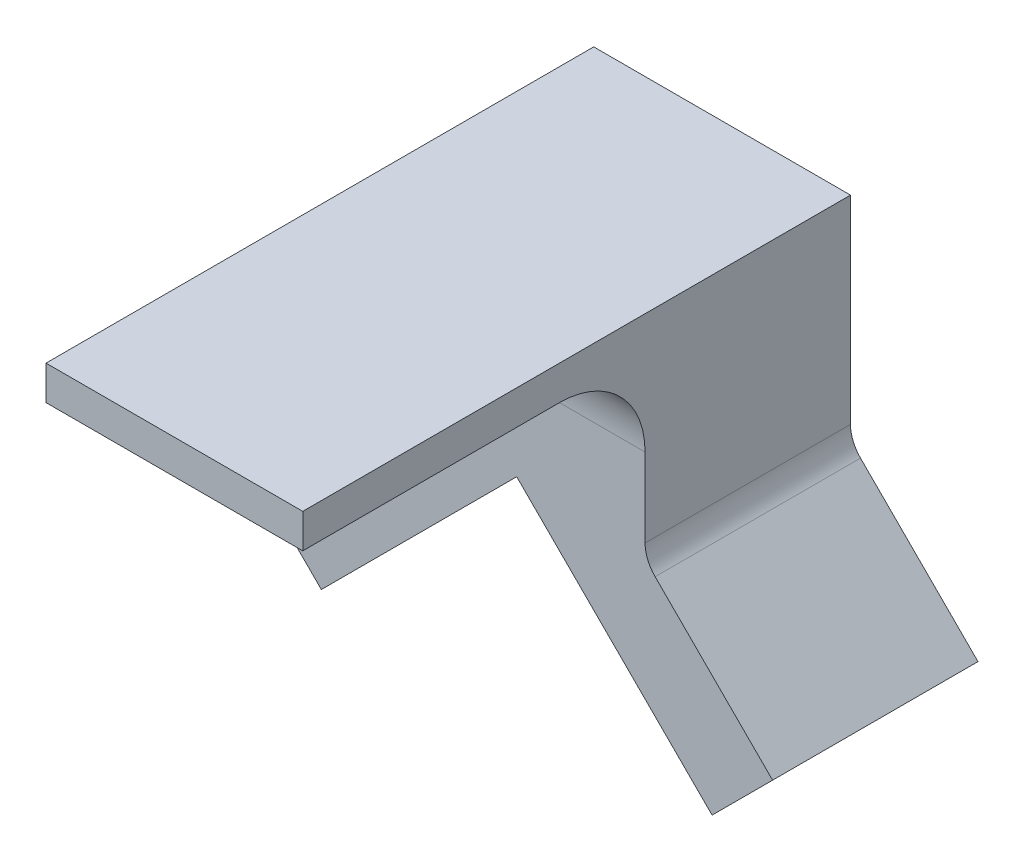
ISO-10303-21;
HEADER;
FILE_DESCRIPTION(('STEP AP214'),'2;1');
FILE_NAME('part.step','',(''),(''),'','','');
FILE_SCHEMA(('AUTOMOTIVE_DESIGN { 1 0 10303 214 1 1 1 1 }'));
ENDSEC;
DATA;
#1=APPLICATION_CONTEXT('core data for automotive mechanical design processes');
#2=APPLICATION_PROTOCOL_DEFINITION('international standard','automotive_design',2000,#1);
#3=PRODUCT_CONTEXT('',#1,'mechanical');
#4=PRODUCT('Part','Part','',(#3));
#5=PRODUCT_RELATED_PRODUCT_CATEGORY('part','',(#4));
#6=PRODUCT_DEFINITION_FORMATION('','',#4);
#7=PRODUCT_DEFINITION_CONTEXT('part definition',#1,'design');
#8=PRODUCT_DEFINITION('design','',#6,#7);
#9=PRODUCT_DEFINITION_SHAPE('','',#8);
#10=(LENGTH_UNIT() NAMED_UNIT(*) SI_UNIT(.MILLI.,.METRE.));
#11=(NAMED_UNIT(*) PLANE_ANGLE_UNIT() SI_UNIT($,.RADIAN.));
#12=(NAMED_UNIT(*) SI_UNIT($,.STERADIAN.) SOLID_ANGLE_UNIT());
#13=UNCERTAINTY_MEASURE_WITH_UNIT(LENGTH_MEASURE(1.E-05),#10,'distance_accuracy_value','');
#14=(GEOMETRIC_REPRESENTATION_CONTEXT(3) GLOBAL_UNCERTAINTY_ASSIGNED_CONTEXT((#13)) GLOBAL_UNIT_ASSIGNED_CONTEXT((#10,
#11,#12)) REPRESENTATION_CONTEXT('',''));
#15=CARTESIAN_POINT('',(0.,0.,0.));
#16=DIRECTION('',(0.,0.,1.));
#17=DIRECTION('',(1.,0.,0.));
#18=AXIS2_PLACEMENT_3D('',#15,#16,#17);
#19=CARTESIAN_POINT('',(5.21446609406726,-5.21446609406726,12.));
#20=DIRECTION('',(-0.707106781186547,0.707106781186547,0.));
#21=DIRECTION('',(-0.707106781186548,-0.707106781186548,0.));
#22=AXIS2_PLACEMENT_3D('',#19,#20,#21);
#23=PLANE('',#22);
#24=DIRECTION('',(0.707106781186548,0.707106781186548,0.));
#25=VECTOR('',#24,1.);
#26=CARTESIAN_POINT('',(5.21446609406726,-5.21446609406726,12.));
#27=LINE('',#26,#25);
#28=CARTESIAN_POINT('',(-7.44974746830575,-17.8786796564403,12.));
#29=VERTEX_POINT('',#28);
#30=CARTESIAN_POINT('',(-0.585786437626904,-11.0147186257614,12.));
#31=VERTEX_POINT('',#30);
#32=EDGE_CURVE('E180',#29,#31,#27,.T.);
#33=ORIENTED_EDGE('',*,*,#32,.T.);
#34=DIRECTION('',(0.,0.,-1.));
#35=VECTOR('',#34,1.);
#36=CARTESIAN_POINT('',(-0.585786437626903,-11.0147186257614,12.));
#37=LINE('',#36,#35);
#38=CARTESIAN_POINT('',(-0.585786437626904,-11.0147186257614,0.));
#39=VERTEX_POINT('',#38);
#40=EDGE_CURVE('E249',#31,#39,#37,.T.);
#41=ORIENTED_EDGE('',*,*,#40,.T.);
#42=DIRECTION('',(0.707106781186548,0.707106781186548,0.));
#43=VECTOR('',#42,1.);
#44=CARTESIAN_POINT('',(5.21446609406726,-5.21446609406726,0.));
#45=LINE('',#44,#43);
#46=CARTESIAN_POINT('',(-7.44974746830575,-17.8786796564403,0.));
#47=VERTEX_POINT('',#46);
#48=EDGE_CURVE('E170',#47,#39,#45,.T.);
#49=ORIENTED_EDGE('',*,*,#48,.F.);
#50=DIRECTION('',(0.,0.,-1.));
#51=VECTOR('',#50,1.);
#52=CARTESIAN_POINT('',(-7.44974746830575,-17.8786796564403,12.));
#53=LINE('',#52,#51);
#54=EDGE_CURVE('E246',#29,#47,#53,.T.);
#55=ORIENTED_EDGE('',*,*,#54,.F.);
#56=EDGE_LOOP('',(#33,#41,#49,#55));
#57=FACE_BOUND('',#56,.T.);
#58=ADVANCED_FACE('F41',(#57),#23,.T.);
#59=CARTESIAN_POINT('',(-12.664213562373,-12.664213562373,12.));
#60=DIRECTION('',(-0.707106781186547,-0.707106781186548,0.));
#61=DIRECTION('',(0.707106781186548,-0.707106781186547,0.));
#62=AXIS2_PLACEMENT_3D('',#59,#60,#61);
#63=PLANE('',#62);
#64=DIRECTION('',(-0.707106781186548,0.707106781186547,0.));
#65=VECTOR('',#64,1.);
#66=CARTESIAN_POINT('',(-12.664213562373,-12.664213562373,0.));
#67=LINE('',#66,#65);
#68=CARTESIAN_POINT('',(-3.91421356237301,-21.414213562373,0.));
#69=VERTEX_POINT('',#68);
#70=EDGE_CURVE('E175',#69,#47,#67,.T.);
#71=ORIENTED_EDGE('',*,*,#70,.F.);
#72=DIRECTION('',(0.,0.,-1.));
#73=VECTOR('',#72,1.);
#74=CARTESIAN_POINT('',(-3.91421356237301,-21.414213562373,12.));
#75=LINE('',#74,#73);
#76=CARTESIAN_POINT('',(-3.91421356237301,-21.414213562373,12.));
#77=VERTEX_POINT('',#76);
#78=EDGE_CURVE('E243',#77,#69,#75,.T.);
#79=ORIENTED_EDGE('',*,*,#78,.F.);
#80=DIRECTION('',(-0.707106781186548,0.707106781186547,0.));
#81=VECTOR('',#80,1.);
#82=CARTESIAN_POINT('',(-12.664213562373,-12.664213562373,12.));
#83=LINE('',#82,#81);
#84=EDGE_CURVE('E184',#77,#29,#83,.T.);
#85=ORIENTED_EDGE('',*,*,#84,.T.);
#86=ORIENTED_EDGE('',*,*,#54,.T.);
#87=EDGE_LOOP('',(#71,#79,#85,#86));
#88=FACE_BOUND('',#87,.T.);
#89=ADVANCED_FACE('F314',(#88),#63,.T.);
#90=CARTESIAN_POINT('',(8.75000000000007,-8.74999999999991,12.));
#91=DIRECTION('',(0.707106781186554,-0.707106781186541,0.));
#92=DIRECTION('',(0.707106781186541,0.707106781186554,0.));
#93=AXIS2_PLACEMENT_3D('',#90,#91,#92);
#94=PLANE('',#93);
#95=DIRECTION('',(-0.707106781186541,-0.707106781186554,0.));
#96=VECTOR('',#95,1.);
#97=CARTESIAN_POINT('',(8.75000000000007,-8.74999999999991,0.));
#98=LINE('',#97,#96);
#99=CARTESIAN_POINT('',(7.5,-9.99999999999999,0.));
#100=VERTEX_POINT('',#99);
#101=EDGE_CURVE('E213',#100,#69,#98,.T.);
#102=ORIENTED_EDGE('',*,*,#101,.F.);
#103=DIRECTION('',(0.,0.,-1.));
#104=VECTOR('',#103,1.);
#105=CARTESIAN_POINT('',(7.5,-9.99999999999999,12.));
#106=LINE('',#105,#104);
#107=CARTESIAN_POINT('',(7.5,-9.99999999999999,12.));
#108=VERTEX_POINT('',#107);
#109=EDGE_CURVE('E240',#108,#100,#106,.T.);
#110=ORIENTED_EDGE('',*,*,#109,.F.);
#111=DIRECTION('',(-0.707106781186541,-0.707106781186554,0.));
#112=VECTOR('',#111,1.);
#113=CARTESIAN_POINT('',(8.75000000000007,-8.74999999999991,12.));
#114=LINE('',#113,#112);
#115=EDGE_CURVE('E189',#108,#77,#114,.T.);
#116=ORIENTED_EDGE('',*,*,#115,.T.);
#117=ORIENTED_EDGE('',*,*,#78,.T.);
#118=EDGE_LOOP('',(#102,#110,#116,#117));
#119=FACE_BOUND('',#118,.T.);
#120=ADVANCED_FACE('F318',(#119),#94,.T.);
#121=CARTESIAN_POINT('',(-1.25000000000001,-1.25000000000001,12.));
#122=DIRECTION('',(0.707106781186547,0.707106781186548,0.));
#123=DIRECTION('',(-0.707106781186548,0.707106781186547,0.));
#124=AXIS2_PLACEMENT_3D('',#121,#122,#123);
#125=PLANE('',#124);
#126=DIRECTION('',(0.707106781186548,-0.707106781186547,0.));
#127=VECTOR('',#126,1.);
#128=CARTESIAN_POINT('',(-1.25000000000001,-1.25000000000001,0.));
#129=LINE('',#128,#127);
#130=CARTESIAN_POINT('',(18.9142135623731,-21.4142135623731,0.));
#131=VERTEX_POINT('',#130);
#132=EDGE_CURVE('E217',#100,#131,#129,.T.);
#133=ORIENTED_EDGE('',*,*,#132,.T.);
#134=DIRECTION('',(0.,0.,-1.));
#135=VECTOR('',#134,1.);
#136=CARTESIAN_POINT('',(18.9142135623731,-21.4142135623731,12.));
#137=LINE('',#136,#135);
#138=CARTESIAN_POINT('',(18.9142135623731,-21.4142135623731,12.));
#139=VERTEX_POINT('',#138);
#140=EDGE_CURVE('E236',#139,#131,#137,.T.);
#141=ORIENTED_EDGE('',*,*,#140,.F.);
#142=DIRECTION('',(0.707106781186548,-0.707106781186547,0.));
#143=VECTOR('',#142,1.);
#144=CARTESIAN_POINT('',(-1.25000000000001,-1.25000000000001,12.));
#145=LINE('',#144,#143);
#146=EDGE_CURVE('E193',#108,#139,#145,.T.);
#147=ORIENTED_EDGE('',*,*,#146,.F.);
#148=ORIENTED_EDGE('',*,*,#109,.T.);
#149=EDGE_LOOP('',(#133,#141,#147,#148));
#150=FACE_BOUND('',#149,.T.);
#151=ADVANCED_FACE('F323',(#150),#125,.F.);
#152=CARTESIAN_POINT('',(20.1642135623731,-20.1642135623731,12.));
#153=DIRECTION('',(-0.707106781186547,0.707106781186547,0.));
#154=DIRECTION('',(-0.707106781186548,-0.707106781186548,0.));
#155=AXIS2_PLACEMENT_3D('',#152,#153,#154);
#156=PLANE('',#155);
#157=DIRECTION('',(0.707106781186548,0.707106781186548,0.));
#158=VECTOR('',#157,1.);
#159=CARTESIAN_POINT('',(20.1642135623731,-20.1642135623731,0.));
#160=LINE('',#159,#158);
#161=CARTESIAN_POINT('',(22.4497474683058,-17.8786796564404,0.));
#162=VERTEX_POINT('',#161);
#163=EDGE_CURVE('E220',#131,#162,#160,.T.);
#164=ORIENTED_EDGE('',*,*,#163,.T.);
#165=DIRECTION('',(0.,0.,-1.));
#166=VECTOR('',#165,1.);
#167=CARTESIAN_POINT('',(22.4497474683058,-17.8786796564404,12.));
#168=LINE('',#167,#166);
#169=CARTESIAN_POINT('',(22.4497474683058,-17.8786796564404,12.));
#170=VERTEX_POINT('',#169);
#171=EDGE_CURVE('E208',#170,#162,#168,.T.);
#172=ORIENTED_EDGE('',*,*,#171,.F.);
#173=DIRECTION('',(0.707106781186548,0.707106781186548,0.));
#174=VECTOR('',#173,1.);
#175=CARTESIAN_POINT('',(20.1642135623731,-20.1642135623731,12.));
#176=LINE('',#175,#174);
#177=EDGE_CURVE('E196',#139,#170,#176,.T.);
#178=ORIENTED_EDGE('',*,*,#177,.F.);
#179=ORIENTED_EDGE('',*,*,#140,.T.);
#180=EDGE_LOOP('',(#164,#172,#178,#179));
#181=FACE_BOUND('',#180,.T.);
#182=ADVANCED_FACE('F329',(#181),#156,.F.);
#183=CARTESIAN_POINT('',(2.28553390593273,2.28553390593273,12.));
#184=DIRECTION('',(-0.707106781186547,-0.707106781186548,0.));
#185=DIRECTION('',(0.707106781186548,-0.707106781186547,0.));
#186=AXIS2_PLACEMENT_3D('',#183,#184,#185);
#187=PLANE('',#186);
#188=DIRECTION('',(-0.707106781186548,0.707106781186547,0.));
#189=VECTOR('',#188,1.);
#190=CARTESIAN_POINT('',(2.28553390593273,2.28553390593273,0.));
#191=LINE('',#190,#189);
#192=CARTESIAN_POINT('',(15.5857864376269,-11.0147186257614,0.));
#193=VERTEX_POINT('',#192);
#194=EDGE_CURVE('E223',#162,#193,#191,.T.);
#195=ORIENTED_EDGE('',*,*,#194,.T.);
#196=DIRECTION('',(0.,0.,-1.));
#197=VECTOR('',#196,1.);
#198=CARTESIAN_POINT('',(15.5857864376269,-11.0147186257614,12.));
#199=LINE('',#198,#197);
#200=CARTESIAN_POINT('',(15.5857864376269,-11.0147186257614,12.));
#201=VERTEX_POINT('',#200);
#202=EDGE_CURVE('E261',#193,#201,#199,.F.);
#203=ORIENTED_EDGE('',*,*,#202,.T.);
#204=DIRECTION('',(-0.707106781186548,0.707106781186547,0.));
#205=VECTOR('',#204,1.);
#206=CARTESIAN_POINT('',(2.28553390593273,2.28553390593273,12.));
#207=LINE('',#206,#205);
#208=EDGE_CURVE('E199',#170,#201,#207,.T.);
#209=ORIENTED_EDGE('',*,*,#208,.F.);
#210=ORIENTED_EDGE('',*,*,#171,.T.);
#211=EDGE_LOOP('',(#195,#203,#209,#210));
#212=FACE_BOUND('',#211,.T.);
#213=ADVANCED_FACE('F333',(#212),#187,.F.);
#214=CARTESIAN_POINT('',(15.,0.,12.));
#215=DIRECTION('',(1.,0.,0.));
#216=DIRECTION('',(0.,1.,0.));
#217=AXIS2_PLACEMENT_3D('',#214,#215,#216);
#218=PLANE('',#217);
#219=DIRECTION('',(0.,0.,-1.));
#220=VECTOR('',#219,1.);
#221=CARTESIAN_POINT('',(15.,0.,0.));
#222=LINE('',#221,#220);
#223=CARTESIAN_POINT('',(15.,0.,32.));
#224=VERTEX_POINT('',#223);
#225=CARTESIAN_POINT('',(15.,0.,17.));
#226=VERTEX_POINT('',#225);
#227=EDGE_CURVE('E163',#224,#226,#222,.T.);
#228=ORIENTED_EDGE('',*,*,#227,.T.);
#229=CARTESIAN_POINT('',(15.,-5.,17.));
#230=DIRECTION('',(1.,0.,0.));
#231=DIRECTION('',(0.,1.,0.));
#232=AXIS2_PLACEMENT_3D('',#229,#230,#231);
#233=CIRCLE('',#232,5.);
#234=CARTESIAN_POINT('',(15.,-5.,12.));
#235=VERTEX_POINT('',#234);
#236=EDGE_CURVE('E50',#226,#235,#233,.F.);
#237=ORIENTED_EDGE('',*,*,#236,.T.);
#238=DIRECTION('',(0.,-1.,0.));
#239=VECTOR('',#238,1.);
#240=CARTESIAN_POINT('',(15.,0.,12.));
#241=LINE('',#240,#239);
#242=CARTESIAN_POINT('',(15.,-9.60050506338833,12.));
#243=VERTEX_POINT('',#242);
#244=EDGE_CURVE('E203',#235,#243,#241,.T.);
#245=ORIENTED_EDGE('',*,*,#244,.T.);
#246=DIRECTION('',(0.,0.,-1.));
#247=VECTOR('',#246,1.);
#248=CARTESIAN_POINT('',(15.,-9.60050506338833,12.));
#249=LINE('',#248,#247);
#250=CARTESIAN_POINT('',(15.,-9.60050506338833,0.));
#251=VERTEX_POINT('',#250);
#252=EDGE_CURVE('E257',#243,#251,#249,.T.);
#253=ORIENTED_EDGE('',*,*,#252,.T.);
#254=DIRECTION('',(0.,-1.,0.));
#255=VECTOR('',#254,1.);
#256=CARTESIAN_POINT('',(15.,0.,0.));
#257=LINE('',#256,#255);
#258=CARTESIAN_POINT('',(15.,2.,0.));
#259=VERTEX_POINT('',#258);
#260=EDGE_CURVE('E227',#259,#251,#257,.T.);
#261=ORIENTED_EDGE('',*,*,#260,.F.);
#262=DIRECTION('',(0.,0.,-1.));
#263=VECTOR('',#262,1.);
#264=CARTESIAN_POINT('',(15.,2.,0.));
#265=LINE('',#264,#263);
#266=CARTESIAN_POINT('',(15.,2.,32.));
#267=VERTEX_POINT('',#266);
#268=EDGE_CURVE('E152',#267,#259,#265,.T.);
#269=ORIENTED_EDGE('',*,*,#268,.F.);
#270=DIRECTION('',(0.,-1.,0.));
#271=VECTOR('',#270,1.);
#272=CARTESIAN_POINT('',(15.,2.,32.));
#273=LINE('',#272,#271);
#274=EDGE_CURVE('E147',#267,#224,#273,.T.);
#275=ORIENTED_EDGE('',*,*,#274,.T.);
#276=EDGE_LOOP('',(#228,#237,#245,#253,#261,#269,#275));
#277=FACE_BOUND('',#276,.T.);
#278=ADVANCED_FACE('F289',(#277),#218,.T.);
#279=CARTESIAN_POINT('',(0.,0.,12.));
#280=DIRECTION('',(1.,0.,0.));
#281=DIRECTION('',(0.,1.,0.));
#282=AXIS2_PLACEMENT_3D('',#279,#280,#281);
#283=PLANE('',#282);
#284=DIRECTION('',(0.,-1.,0.));
#285=VECTOR('',#284,1.);
#286=CARTESIAN_POINT('',(0.,0.,0.));
#287=LINE('',#286,#285);
#288=CARTESIAN_POINT('',(0.,2.,0.));
#289=VERTEX_POINT('',#288);
#290=CARTESIAN_POINT('',(0.,-9.60050506338833,0.));
#291=VERTEX_POINT('',#290);
#292=EDGE_CURVE('E185',#289,#291,#287,.T.);
#293=ORIENTED_EDGE('',*,*,#292,.T.);
#294=DIRECTION('',(0.,0.,-1.));
#295=VECTOR('',#294,1.);
#296=CARTESIAN_POINT('',(0.,-9.60050506338833,12.));
#297=LINE('',#296,#295);
#298=CARTESIAN_POINT('',(0.,-9.60050506338833,12.));
#299=VERTEX_POINT('',#298);
#300=EDGE_CURVE('E253',#291,#299,#297,.F.);
#301=ORIENTED_EDGE('',*,*,#300,.T.);
#302=DIRECTION('',(0.,-1.,0.));
#303=VECTOR('',#302,1.);
#304=CARTESIAN_POINT('',(0.,0.,12.));
#305=LINE('',#304,#303);
#306=CARTESIAN_POINT('',(0.,-5.,12.));
#307=VERTEX_POINT('',#306);
#308=EDGE_CURVE('E206',#307,#299,#305,.T.);
#309=ORIENTED_EDGE('',*,*,#308,.F.);
#310=CARTESIAN_POINT('',(0.,-5.,17.));
#311=DIRECTION('',(1.,0.,0.));
#312=DIRECTION('',(0.,1.,0.));
#313=AXIS2_PLACEMENT_3D('',#310,#311,#312);
#314=CIRCLE('',#313,5.);
#315=CARTESIAN_POINT('',(0.,0.,17.));
#316=VERTEX_POINT('',#315);
#317=EDGE_CURVE('E11',#307,#316,#314,.T.);
#318=ORIENTED_EDGE('',*,*,#317,.T.);
#319=DIRECTION('',(0.,0.,1.));
#320=VECTOR('',#319,1.);
#321=CARTESIAN_POINT('',(0.,0.,0.));
#322=LINE('',#321,#320);
#323=CARTESIAN_POINT('',(0.,0.,32.));
#324=VERTEX_POINT('',#323);
#325=EDGE_CURVE('E167',#316,#324,#322,.T.);
#326=ORIENTED_EDGE('',*,*,#325,.T.);
#327=DIRECTION('',(0.,-1.,0.));
#328=VECTOR('',#327,1.);
#329=CARTESIAN_POINT('',(0.,2.,32.));
#330=LINE('',#329,#328);
#331=CARTESIAN_POINT('',(0.,2.,32.));
#332=VERTEX_POINT('',#331);
#333=EDGE_CURVE('E145',#332,#324,#330,.T.);
#334=ORIENTED_EDGE('',*,*,#333,.F.);
#335=DIRECTION('',(0.,0.,1.));
#336=VECTOR('',#335,1.);
#337=CARTESIAN_POINT('',(0.,2.,0.));
#338=LINE('',#337,#336);
#339=EDGE_CURVE('E153',#289,#332,#338,.T.);
#340=ORIENTED_EDGE('',*,*,#339,.F.);
#341=EDGE_LOOP('',(#293,#301,#309,#318,#326,#334,#340));
#342=FACE_BOUND('',#341,.T.);
#343=ADVANCED_FACE('F165',(#342),#283,.F.);
#344=CARTESIAN_POINT('',(0.,0.,12.));
#345=DIRECTION('',(0.,0.,1.));
#346=DIRECTION('',(1.,0.,0.));
#347=AXIS2_PLACEMENT_3D('',#344,#345,#346);
#348=PLANE('',#347);
#349=ORIENTED_EDGE('',*,*,#244,.F.);
#350=DIRECTION('',(1.,0.,0.));
#351=VECTOR('',#350,1.);
#352=CARTESIAN_POINT('',(0.,-5.,12.));
#353=LINE('',#352,#351);
#354=EDGE_CURVE('E57',#235,#307,#353,.F.);
#355=ORIENTED_EDGE('',*,*,#354,.T.);
#356=ORIENTED_EDGE('',*,*,#308,.T.);
#357=CARTESIAN_POINT('',(-2.,-9.60050506338833,12.));
#358=DIRECTION('',(0.,0.,1.));
#359=DIRECTION('',(1.,0.,0.));
#360=AXIS2_PLACEMENT_3D('',#357,#358,#359);
#361=CIRCLE('',#360,2.);
#362=EDGE_CURVE('E267',#299,#31,#361,.F.);
#363=ORIENTED_EDGE('',*,*,#362,.T.);
#364=ORIENTED_EDGE('',*,*,#32,.F.);
#365=ORIENTED_EDGE('',*,*,#84,.F.);
#366=ORIENTED_EDGE('',*,*,#115,.F.);
#367=ORIENTED_EDGE('',*,*,#146,.T.);
#368=ORIENTED_EDGE('',*,*,#177,.T.);
#369=ORIENTED_EDGE('',*,*,#208,.T.);
#370=CARTESIAN_POINT('',(17.,-9.60050506338833,12.));
#371=DIRECTION('',(0.,0.,1.));
#372=DIRECTION('',(1.,0.,0.));
#373=AXIS2_PLACEMENT_3D('',#370,#371,#372);
#374=CIRCLE('',#373,2.);
#375=EDGE_CURVE('E273',#201,#243,#374,.F.);
#376=ORIENTED_EDGE('',*,*,#375,.T.);
#377=EDGE_LOOP('',(#349,#355,#356,#363,#364,#365,#366,#367,#368,#369,#376));
#378=FACE_BOUND('',#377,.T.);
#379=ADVANCED_FACE('F308',(#378),#348,.T.);
#380=CARTESIAN_POINT('',(0.,0.,0.));
#381=DIRECTION('',(0.,0.,1.));
#382=DIRECTION('',(1.,0.,0.));
#383=AXIS2_PLACEMENT_3D('',#380,#381,#382);
#384=PLANE('',#383);
#385=ORIENTED_EDGE('',*,*,#48,.T.);
#386=CARTESIAN_POINT('',(-2.,-9.60050506338833,0.));
#387=DIRECTION('',(0.,0.,1.));
#388=DIRECTION('',(1.,0.,0.));
#389=AXIS2_PLACEMENT_3D('',#386,#387,#388);
#390=CIRCLE('',#389,2.);
#391=EDGE_CURVE('E264',#39,#291,#390,.T.);
#392=ORIENTED_EDGE('',*,*,#391,.T.);
#393=ORIENTED_EDGE('',*,*,#292,.F.);
#394=DIRECTION('',(-1.,0.,0.));
#395=VECTOR('',#394,1.);
#396=CARTESIAN_POINT('',(0.,2.,0.));
#397=LINE('',#396,#395);
#398=EDGE_CURVE('E159',#259,#289,#397,.T.);
#399=ORIENTED_EDGE('',*,*,#398,.F.);
#400=ORIENTED_EDGE('',*,*,#260,.T.);
#401=CARTESIAN_POINT('',(17.,-9.60050506338833,0.));
#402=DIRECTION('',(0.,0.,1.));
#403=DIRECTION('',(1.,0.,0.));
#404=AXIS2_PLACEMENT_3D('',#401,#402,#403);
#405=CIRCLE('',#404,2.);
#406=EDGE_CURVE('E270',#251,#193,#405,.T.);
#407=ORIENTED_EDGE('',*,*,#406,.T.);
#408=ORIENTED_EDGE('',*,*,#194,.F.);
#409=ORIENTED_EDGE('',*,*,#163,.F.);
#410=ORIENTED_EDGE('',*,*,#132,.F.);
#411=ORIENTED_EDGE('',*,*,#101,.T.);
#412=ORIENTED_EDGE('',*,*,#70,.T.);
#413=EDGE_LOOP('',(#385,#392,#393,#399,#400,#407,#408,#409,#410,#411,#412));
#414=FACE_BOUND('',#413,.T.);
#415=ADVANCED_FACE('F301',(#414),#384,.F.);
#416=CARTESIAN_POINT('',(0.,0.,0.));
#417=DIRECTION('',(0.,1.,0.));
#418=DIRECTION('',(0.,0.,1.));
#419=AXIS2_PLACEMENT_3D('',#416,#417,#418);
#420=PLANE('',#419);
#421=ORIENTED_EDGE('',*,*,#325,.F.);
#422=DIRECTION('',(1.,0.,0.));
#423=VECTOR('',#422,1.);
#424=CARTESIAN_POINT('',(0.,0.,17.));
#425=LINE('',#424,#423);
#426=EDGE_CURVE('E277',#316,#226,#425,.T.);
#427=ORIENTED_EDGE('',*,*,#426,.T.);
#428=ORIENTED_EDGE('',*,*,#227,.F.);
#429=DIRECTION('',(1.,0.,0.));
#430=VECTOR('',#429,1.);
#431=CARTESIAN_POINT('',(0.,0.,32.));
#432=LINE('',#431,#430);
#433=EDGE_CURVE('E291',#324,#224,#432,.T.);
#434=ORIENTED_EDGE('',*,*,#433,.F.);
#435=EDGE_LOOP('',(#421,#427,#428,#434));
#436=FACE_BOUND('',#435,.T.);
#437=ADVANCED_FACE('F286',(#436),#420,.F.);
#438=CARTESIAN_POINT('',(0.,2.,32.));
#439=DIRECTION('',(0.,0.,-1.));
#440=DIRECTION('',(-1.,0.,0.));
#441=AXIS2_PLACEMENT_3D('',#438,#439,#440);
#442=PLANE('',#441);
#443=ORIENTED_EDGE('',*,*,#433,.T.);
#444=ORIENTED_EDGE('',*,*,#274,.F.);
#445=DIRECTION('',(1.,0.,0.));
#446=VECTOR('',#445,1.);
#447=CARTESIAN_POINT('',(0.,2.,32.));
#448=LINE('',#447,#446);
#449=EDGE_CURVE('E141',#332,#267,#448,.T.);
#450=ORIENTED_EDGE('',*,*,#449,.F.);
#451=ORIENTED_EDGE('',*,*,#333,.T.);
#452=EDGE_LOOP('',(#443,#444,#450,#451));
#453=FACE_BOUND('',#452,.T.);
#454=ADVANCED_FACE('F143',(#453),#442,.F.);
#455=CARTESIAN_POINT('',(0.,2.,0.));
#456=DIRECTION('',(0.,1.,0.));
#457=DIRECTION('',(0.,0.,1.));
#458=AXIS2_PLACEMENT_3D('',#455,#456,#457);
#459=PLANE('',#458);
#460=ORIENTED_EDGE('',*,*,#339,.T.);
#461=ORIENTED_EDGE('',*,*,#449,.T.);
#462=ORIENTED_EDGE('',*,*,#268,.T.);
#463=ORIENTED_EDGE('',*,*,#398,.T.);
#464=EDGE_LOOP('',(#460,#461,#462,#463));
#465=FACE_BOUND('',#464,.T.);
#466=ADVANCED_FACE('F157',(#465),#459,.T.);
#467=CARTESIAN_POINT('',(-2.,-9.60050506338833,12.));
#468=DIRECTION('',(0.,0.,-1.));
#469=DIRECTION('',(-1.,0.,0.));
#470=AXIS2_PLACEMENT_3D('',#467,#468,#469);
#471=CYLINDRICAL_SURFACE('',#470,2.);
#472=ORIENTED_EDGE('',*,*,#362,.F.);
#473=ORIENTED_EDGE('',*,*,#300,.F.);
#474=ORIENTED_EDGE('',*,*,#391,.F.);
#475=ORIENTED_EDGE('',*,*,#40,.F.);
#476=EDGE_LOOP('',(#472,#473,#474,#475));
#477=FACE_BOUND('',#476,.T.);
#478=ADVANCED_FACE('F305',(#477),#471,.F.);
#479=CARTESIAN_POINT('',(17.,-9.60050506338833,12.));
#480=DIRECTION('',(0.,0.,-1.));
#481=DIRECTION('',(-1.,0.,0.));
#482=AXIS2_PLACEMENT_3D('',#479,#480,#481);
#483=CYLINDRICAL_SURFACE('',#482,2.);
#484=ORIENTED_EDGE('',*,*,#375,.F.);
#485=ORIENTED_EDGE('',*,*,#202,.F.);
#486=ORIENTED_EDGE('',*,*,#406,.F.);
#487=ORIENTED_EDGE('',*,*,#252,.F.);
#488=EDGE_LOOP('',(#484,#485,#486,#487));
#489=FACE_BOUND('',#488,.T.);
#490=ADVANCED_FACE('F336',(#489),#483,.F.);
#491=CARTESIAN_POINT('',(0.,-5.,17.));
#492=DIRECTION('',(1.,0.,0.));
#493=DIRECTION('',(0.,0.,-1.));
#494=AXIS2_PLACEMENT_3D('',#491,#492,#493);
#495=CYLINDRICAL_SURFACE('',#494,5.);
#496=ORIENTED_EDGE('',*,*,#317,.F.);
#497=ORIENTED_EDGE('',*,*,#354,.F.);
#498=ORIENTED_EDGE('',*,*,#236,.F.);
#499=ORIENTED_EDGE('',*,*,#426,.F.);
#500=EDGE_LOOP('',(#496,#497,#498,#499));
#501=FACE_BOUND('',#500,.T.);
#502=ADVANCED_FACE('F43',(#501),#495,.F.);
#503=CLOSED_SHELL('',(#58,#89,#120,#151,#182,#213,#278,#343,#379,#415,#437,#454,#466,#478,#490,#502));
#504=MANIFOLD_SOLID_BREP('B2',#503);
#505=ADVANCED_BREP_SHAPE_REPRESENTATION('',(#18,#504),#14);
#506=SHAPE_DEFINITION_REPRESENTATION(#9,#505);
ENDSEC;
END-ISO-10303-21;
